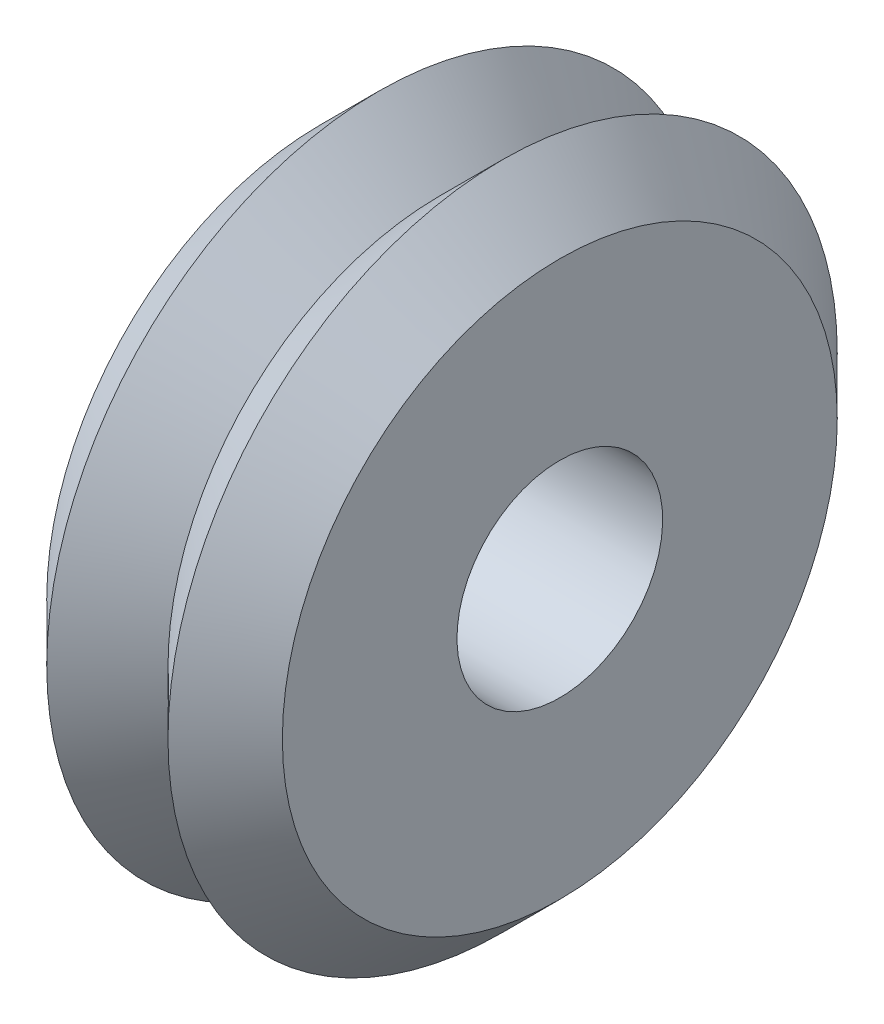
ISO-10303-21;
HEADER;
FILE_DESCRIPTION(('STEP AP214'),'2;1');
FILE_NAME('part.step','',(''),(''),'','','');
FILE_SCHEMA(('AUTOMOTIVE_DESIGN { 1 0 10303 214 1 1 1 1 }'));
ENDSEC;
DATA;
#1=APPLICATION_CONTEXT('core data for automotive mechanical design processes');
#2=APPLICATION_PROTOCOL_DEFINITION('international standard','automotive_design',2000,#1);
#3=PRODUCT_CONTEXT('',#1,'mechanical');
#4=PRODUCT('Part','Part','',(#3));
#5=PRODUCT_RELATED_PRODUCT_CATEGORY('part','',(#4));
#6=PRODUCT_DEFINITION_FORMATION('','',#4);
#7=PRODUCT_DEFINITION_CONTEXT('part definition',#1,'design');
#8=PRODUCT_DEFINITION('design','',#6,#7);
#9=PRODUCT_DEFINITION_SHAPE('','',#8);
#10=(LENGTH_UNIT() NAMED_UNIT(*) SI_UNIT(.MILLI.,.METRE.));
#11=(NAMED_UNIT(*) PLANE_ANGLE_UNIT() SI_UNIT($,.RADIAN.));
#12=(NAMED_UNIT(*) SI_UNIT($,.STERADIAN.) SOLID_ANGLE_UNIT());
#13=UNCERTAINTY_MEASURE_WITH_UNIT(LENGTH_MEASURE(1.E-05),#10,'distance_accuracy_value','');
#14=(GEOMETRIC_REPRESENTATION_CONTEXT(3) GLOBAL_UNCERTAINTY_ASSIGNED_CONTEXT((#13)) GLOBAL_UNIT_ASSIGNED_CONTEXT((#10,
#11,#12)) REPRESENTATION_CONTEXT('',''));
#15=CARTESIAN_POINT('',(0.,0.,0.));
#16=DIRECTION('',(0.,0.,1.));
#17=DIRECTION('',(1.,0.,0.));
#18=AXIS2_PLACEMENT_3D('',#15,#16,#17);
#19=CARTESIAN_POINT('',(0.,-12.65555,0.));
#20=DIRECTION('',(-1.,0.,0.));
#21=DIRECTION('',(0.,-1.,0.));
#22=AXIS2_PLACEMENT_3D('',#19,#20,#21);
#23=PLANE('',#22);
#24=CARTESIAN_POINT('',(0.,-12.65555,0.));
#25=DIRECTION('',(1.,0.,0.));
#26=DIRECTION('',(0.,1.,0.));
#27=AXIS2_PLACEMENT_3D('',#24,#25,#26);
#28=CIRCLE('',#27,4.7625);
#29=CARTESIAN_POINT('',(0.,-7.89305,0.));
#30=VERTEX_POINT('',#29);
#31=EDGE_CURVE('E55',#30,#30,#28,.T.);
#32=ORIENTED_EDGE('',*,*,#31,.T.);
#33=EDGE_LOOP('',(#32));
#34=FACE_BOUND('',#33,.T.);
#35=CARTESIAN_POINT('',(0.,-12.65555,0.));
#36=DIRECTION('',(1.,0.,0.));
#37=DIRECTION('',(0.,1.,0.));
#38=AXIS2_PLACEMENT_3D('',#35,#36,#37);
#39=CIRCLE('',#38,12.65555);
#40=CARTESIAN_POINT('',(0.,0.,0.));
#41=VERTEX_POINT('',#40);
#42=EDGE_CURVE('E52',#41,#41,#39,.T.);
#43=ORIENTED_EDGE('',*,*,#42,.F.);
#44=EDGE_LOOP('',(#43));
#45=FACE_BOUND('',#44,.T.);
#46=ADVANCED_FACE('F33',(#34,#45),#23,.T.);
#47=CARTESIAN_POINT('',(11.0998,0.1905,0.));
#48=DIRECTION('',(1.,0.,0.));
#49=DIRECTION('',(0.,1.,0.));
#50=AXIS2_PLACEMENT_3D('',#47,#48,#49);
#51=PLANE('',#50);
#52=CARTESIAN_POINT('',(11.0998,-12.65555,0.));
#53=DIRECTION('',(1.,0.,0.));
#54=DIRECTION('',(0.,1.,0.));
#55=AXIS2_PLACEMENT_3D('',#52,#53,#54);
#56=CIRCLE('',#55,4.7625);
#57=CARTESIAN_POINT('',(11.0998,-7.89305,0.));
#58=VERTEX_POINT('',#57);
#59=EDGE_CURVE('E56',#58,#58,#56,.T.);
#60=ORIENTED_EDGE('',*,*,#59,.F.);
#61=EDGE_LOOP('',(#60));
#62=FACE_BOUND('',#61,.T.);
#63=CARTESIAN_POINT('',(11.0998,-12.65555,0.));
#64=DIRECTION('',(1.,0.,0.));
#65=DIRECTION('',(0.,1.,0.));
#66=AXIS2_PLACEMENT_3D('',#63,#64,#65);
#67=CIRCLE('',#66,12.84605);
#68=CARTESIAN_POINT('',(11.0998,0.1905,0.));
#69=VERTEX_POINT('',#68);
#70=EDGE_CURVE('E10',#69,#69,#67,.T.);
#71=ORIENTED_EDGE('',*,*,#70,.T.);
#72=EDGE_LOOP('',(#71));
#73=FACE_BOUND('',#72,.T.);
#74=ADVANCED_FACE('F71',(#62,#73),#51,.T.);
#75=CARTESIAN_POINT('',(11.0998,-12.65555,0.));
#76=DIRECTION('',(-1.,0.,0.));
#77=DIRECTION('',(0.,-1.,0.));
#78=AXIS2_PLACEMENT_3D('',#75,#76,#77);
#79=CONICAL_SURFACE('',#78,12.84605,0.785398163397448);
#80=CARTESIAN_POINT('',(8.45184999999999,-12.65555,0.));
#81=DIRECTION('',(1.,0.,0.));
#82=DIRECTION('',(0.,1.,0.));
#83=AXIS2_PLACEMENT_3D('',#80,#81,#82);
#84=CIRCLE('',#83,15.494);
#85=CARTESIAN_POINT('',(8.45184999999999,2.83845,0.));
#86=VERTEX_POINT('',#85);
#87=EDGE_CURVE('E39',#86,#86,#84,.T.);
#88=ORIENTED_EDGE('',*,*,#87,.T.);
#89=EDGE_LOOP('',(#88));
#90=FACE_BOUND('',#89,.T.);
#91=ORIENTED_EDGE('',*,*,#70,.F.);
#92=EDGE_LOOP('',(#91));
#93=FACE_BOUND('',#92,.T.);
#94=ADVANCED_FACE('F73',(#90,#93),#79,.T.);
#95=CARTESIAN_POINT('',(8.45184999999999,-12.65555,0.));
#96=DIRECTION('',(1.,0.,0.));
#97=DIRECTION('',(0.,1.,0.));
#98=AXIS2_PLACEMENT_3D('',#95,#96,#97);
#99=CONICAL_SURFACE('',#98,15.494,0.785398163397449);
#100=CARTESIAN_POINT('',(5.51814999999999,-12.65555,0.));
#101=DIRECTION('',(1.,0.,0.));
#102=DIRECTION('',(0.,1.,0.));
#103=AXIS2_PLACEMENT_3D('',#100,#101,#102);
#104=CIRCLE('',#103,12.5603);
#105=CARTESIAN_POINT('',(5.51814999999999,-0.0952500000000033,0.));
#106=VERTEX_POINT('',#105);
#107=EDGE_CURVE('E43',#106,#106,#104,.T.);
#108=ORIENTED_EDGE('',*,*,#107,.T.);
#109=EDGE_LOOP('',(#108));
#110=FACE_BOUND('',#109,.T.);
#111=ORIENTED_EDGE('',*,*,#87,.F.);
#112=EDGE_LOOP('',(#111));
#113=FACE_BOUND('',#112,.T.);
#114=ADVANCED_FACE('F78',(#110,#113),#99,.T.);
#115=CARTESIAN_POINT('',(5.51814999999999,-12.65555,0.));
#116=DIRECTION('',(-1.,0.,0.));
#117=DIRECTION('',(0.,-1.,0.));
#118=AXIS2_PLACEMENT_3D('',#115,#116,#117);
#119=CONICAL_SURFACE('',#118,12.5603,0.785398163397448);
#120=CARTESIAN_POINT('',(2.71144999999999,-12.65555,0.));
#121=DIRECTION('',(1.,0.,0.));
#122=DIRECTION('',(0.,1.,0.));
#123=AXIS2_PLACEMENT_3D('',#120,#121,#122);
#124=CIRCLE('',#123,15.367);
#125=CARTESIAN_POINT('',(2.71144999999999,2.71145,0.));
#126=VERTEX_POINT('',#125);
#127=EDGE_CURVE('E47',#126,#126,#124,.T.);
#128=ORIENTED_EDGE('',*,*,#127,.T.);
#129=EDGE_LOOP('',(#128));
#130=FACE_BOUND('',#129,.T.);
#131=ORIENTED_EDGE('',*,*,#107,.F.);
#132=EDGE_LOOP('',(#131));
#133=FACE_BOUND('',#132,.T.);
#134=ADVANCED_FACE('F83',(#130,#133),#119,.T.);
#135=CARTESIAN_POINT('',(2.71144999999999,-12.65555,0.));
#136=DIRECTION('',(1.,0.,0.));
#137=DIRECTION('',(0.,1.,0.));
#138=AXIS2_PLACEMENT_3D('',#135,#136,#137);
#139=CONICAL_SURFACE('',#138,15.367,0.78539816339745);
#140=ORIENTED_EDGE('',*,*,#42,.T.);
#141=EDGE_LOOP('',(#140));
#142=FACE_BOUND('',#141,.T.);
#143=ORIENTED_EDGE('',*,*,#127,.F.);
#144=EDGE_LOOP('',(#143));
#145=FACE_BOUND('',#144,.T.);
#146=ADVANCED_FACE('F67',(#142,#145),#139,.T.);
#147=CARTESIAN_POINT('',(0.,-12.65555,0.));
#148=DIRECTION('',(1.,0.,0.));
#149=DIRECTION('',(0.,1.,0.));
#150=AXIS2_PLACEMENT_3D('',#147,#148,#149);
#151=CYLINDRICAL_SURFACE('',#150,4.7625);
#152=ORIENTED_EDGE('',*,*,#31,.F.);
#153=EDGE_LOOP('',(#152));
#154=FACE_BOUND('',#153,.T.);
#155=ORIENTED_EDGE('',*,*,#59,.T.);
#156=EDGE_LOOP('',(#155));
#157=FACE_BOUND('',#156,.T.);
#158=ADVANCED_FACE('F64',(#154,#157),#151,.F.);
#159=CLOSED_SHELL('',(#46,#74,#94,#114,#134,#146,#158));
#160=MANIFOLD_SOLID_BREP('B2',#159);
#161=ADVANCED_BREP_SHAPE_REPRESENTATION('',(#18,#160),#14);
#162=SHAPE_DEFINITION_REPRESENTATION(#9,#161);
ENDSEC;
END-ISO-10303-21;
